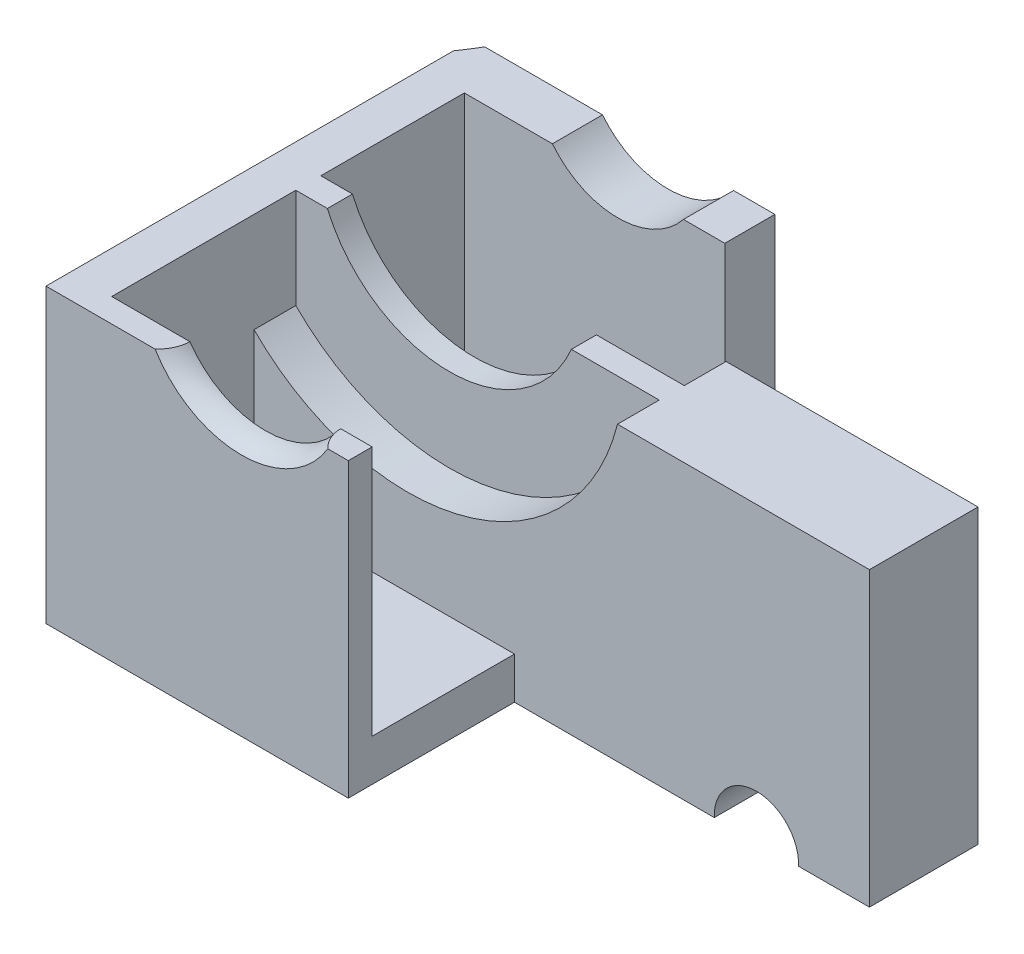
ISO-10303-21;
HEADER;
FILE_DESCRIPTION(('STEP AP214'),'2;1');
FILE_NAME('part.step','',(''),(''),'','','');
FILE_SCHEMA(('AUTOMOTIVE_DESIGN { 1 0 10303 214 1 1 1 1 }'));
ENDSEC;
DATA;
#1=APPLICATION_CONTEXT('core data for automotive mechanical design processes');
#2=APPLICATION_PROTOCOL_DEFINITION('international standard','automotive_design',2000,#1);
#3=PRODUCT_CONTEXT('',#1,'mechanical');
#4=PRODUCT('Part','Part','',(#3));
#5=PRODUCT_RELATED_PRODUCT_CATEGORY('part','',(#4));
#6=PRODUCT_DEFINITION_FORMATION('','',#4);
#7=PRODUCT_DEFINITION_CONTEXT('part definition',#1,'design');
#8=PRODUCT_DEFINITION('design','',#6,#7);
#9=PRODUCT_DEFINITION_SHAPE('','',#8);
#10=(LENGTH_UNIT() NAMED_UNIT(*) SI_UNIT(.MILLI.,.METRE.));
#11=(NAMED_UNIT(*) PLANE_ANGLE_UNIT() SI_UNIT($,.RADIAN.));
#12=(NAMED_UNIT(*) SI_UNIT($,.STERADIAN.) SOLID_ANGLE_UNIT());
#13=UNCERTAINTY_MEASURE_WITH_UNIT(LENGTH_MEASURE(1.E-05),#10,'distance_accuracy_value','');
#14=(GEOMETRIC_REPRESENTATION_CONTEXT(3) GLOBAL_UNCERTAINTY_ASSIGNED_CONTEXT((#13)) GLOBAL_UNIT_ASSIGNED_CONTEXT((#10,
#11,#12)) REPRESENTATION_CONTEXT('',''));
#15=CARTESIAN_POINT('',(0.,0.,0.));
#16=DIRECTION('',(0.,0.,1.));
#17=DIRECTION('',(1.,0.,0.));
#18=AXIS2_PLACEMENT_3D('',#15,#16,#17);
#19=CARTESIAN_POINT('',(0.,50.8,0.));
#20=DIRECTION('',(0.,-1.,0.));
#21=DIRECTION('',(0.,0.,-1.));
#22=AXIS2_PLACEMENT_3D('',#19,#20,#21);
#23=PLANE('',#22);
#24=DIRECTION('',(0.866025403784436,0.,0.500000000000005));
#25=VECTOR('',#24,1.);
#26=CARTESIAN_POINT('',(219.202,50.8,-83.6273104035633));
#27=LINE('',#26,#25);
#28=CARTESIAN_POINT('',(200.279,50.8,-94.5525095474388));
#29=VERTEX_POINT('',#28);
#30=CARTESIAN_POINT('',(219.202,50.8,-83.6273104035633));
#31=VERTEX_POINT('',#30);
#32=EDGE_CURVE('E301',#29,#31,#27,.T.);
#33=ORIENTED_EDGE('',*,*,#32,.F.);
#34=DIRECTION('',(0.,0.,-1.));
#35=VECTOR('',#34,1.);
#36=CARTESIAN_POINT('',(200.279,50.8,-94.5525095474388));
#37=LINE('',#36,#35);
#38=CARTESIAN_POINT('',(200.279,50.8,-50.5424504525612));
#39=VERTEX_POINT('',#38);
#40=EDGE_CURVE('E321',#39,#29,#37,.T.);
#41=ORIENTED_EDGE('',*,*,#40,.F.);
#42=DIRECTION('',(-0.866025403784436,0.,0.500000000000004));
#43=VECTOR('',#42,1.);
#44=CARTESIAN_POINT('',(200.279,50.8,-50.5424504525612));
#45=LINE('',#44,#43);
#46=CARTESIAN_POINT('',(219.202,50.8,-61.4676495964367));
#47=VERTEX_POINT('',#46);
#48=EDGE_CURVE('E115',#47,#39,#45,.T.);
#49=ORIENTED_EDGE('',*,*,#48,.F.);
#50=DIRECTION('',(0.,0.,1.));
#51=VECTOR('',#50,1.);
#52=CARTESIAN_POINT('',(219.202,50.8,-4.60248000000001));
#53=LINE('',#52,#51);
#54=EDGE_CURVE('E122',#31,#47,#53,.T.);
#55=ORIENTED_EDGE('',*,*,#54,.F.);
#56=EDGE_LOOP('',(#33,#41,#49,#55));
#57=FACE_BOUND('',#56,.T.);
#58=ADVANCED_FACE('F58',(#57),#23,.F.);
#59=CARTESIAN_POINT('',(0.,12.7,0.));
#60=DIRECTION('',(0.,-1.,0.));
#61=DIRECTION('',(0.,0.,-1.));
#62=AXIS2_PLACEMENT_3D('',#59,#60,#61);
#63=PLANE('',#62);
#64=DIRECTION('',(0.,0.,1.));
#65=VECTOR('',#64,1.);
#66=CARTESIAN_POINT('',(311.15,12.7,-4.60248000000001));
#67=LINE('',#66,#65);
#68=CARTESIAN_POINT('',(311.15,12.7,-55.13324));
#69=VERTEX_POINT('',#68);
#70=CARTESIAN_POINT('',(311.15,12.7,-11.84656));
#71=VERTEX_POINT('',#70);
#72=EDGE_CURVE('E168',#69,#71,#67,.T.);
#73=ORIENTED_EDGE('',*,*,#72,.F.);
#74=DIRECTION('',(-1.,0.,0.));
#75=VECTOR('',#74,1.);
#76=CARTESIAN_POINT('',(419.1,12.7,-55.13324));
#77=LINE('',#76,#75);
#78=CARTESIAN_POINT('',(231.939280820751,12.7,-55.13324));
#79=VERTEX_POINT('',#78);
#80=EDGE_CURVE('E502',#69,#79,#77,.T.);
#81=ORIENTED_EDGE('',*,*,#80,.T.);
#82=DIRECTION('',(0.,0.,1.));
#83=VECTOR('',#82,1.);
#84=CARTESIAN_POINT('',(231.939280820751,12.7,-55.1332399999999));
#85=LINE('',#84,#83);
#86=CARTESIAN_POINT('',(231.939280820751,12.7,-11.84656));
#87=VERTEX_POINT('',#86);
#88=EDGE_CURVE('E140',#79,#87,#85,.T.);
#89=ORIENTED_EDGE('',*,*,#88,.T.);
#90=DIRECTION('',(1.,0.,0.));
#91=VECTOR('',#90,1.);
#92=CARTESIAN_POINT('',(231.939280820751,12.7,-11.84656));
#93=LINE('',#92,#91);
#94=EDGE_CURVE('E165',#87,#71,#93,.T.);
#95=ORIENTED_EDGE('',*,*,#94,.T.);
#96=EDGE_LOOP('',(#73,#81,#89,#95));
#97=FACE_BOUND('',#96,.T.);
#98=ADVANCED_FACE('F199',(#97),#63,.F.);
#99=CARTESIAN_POINT('',(278.649352084686,104.852009966003,-189.080548980707));
#100=DIRECTION('',(0.,0.,1.));
#101=DIRECTION('',(1.,0.,0.));
#102=AXIS2_PLACEMENT_3D('',#99,#100,#101);
#103=CYLINDRICAL_SURFACE('',#102,65.786);
#104=CARTESIAN_POINT('',(278.649352084686,104.852009966003,-67.83324));
#105=DIRECTION('',(0.,0.,-1.));
#106=DIRECTION('',(-1.,0.,0.));
#107=AXIS2_PLACEMENT_3D('',#104,#105,#106);
#108=CIRCLE('',#107,65.786);
#109=CARTESIAN_POINT('',(231.939280820751,58.5274264436635,-67.83324));
#110=VERTEX_POINT('',#109);
#111=CARTESIAN_POINT('',(342.472006166481,88.9,-67.83324));
#112=VERTEX_POINT('',#111);
#113=EDGE_CURVE('E508',#110,#112,#108,.F.);
#114=ORIENTED_EDGE('',*,*,#113,.F.);
#115=DIRECTION('',(0.,0.,1.));
#116=VECTOR('',#115,1.);
#117=CARTESIAN_POINT('',(231.939280820751,58.5274264436635,-189.080548980707));
#118=LINE('',#117,#116);
#119=CARTESIAN_POINT('',(231.939280820751,58.5274264436635,-55.1332399999999));
#120=VERTEX_POINT('',#119);
#121=EDGE_CURVE('E507',#110,#120,#118,.T.);
#122=ORIENTED_EDGE('',*,*,#121,.T.);
#123=CARTESIAN_POINT('',(278.649352084686,104.852009966003,-55.1332399999999));
#124=DIRECTION('',(0.,0.,1.));
#125=DIRECTION('',(1.,0.,0.));
#126=AXIS2_PLACEMENT_3D('',#123,#124,#125);
#127=CIRCLE('',#126,65.786);
#128=CARTESIAN_POINT('',(342.472006166481,88.9,-55.1332399999999));
#129=VERTEX_POINT('',#128);
#130=EDGE_CURVE('E512',#120,#129,#127,.T.);
#131=ORIENTED_EDGE('',*,*,#130,.T.);
#132=DIRECTION('',(0.,0.,1.));
#133=VECTOR('',#132,1.);
#134=CARTESIAN_POINT('',(342.472006166481,88.9,-189.080548980707));
#135=LINE('',#134,#133);
#136=EDGE_CURVE('E519',#112,#129,#135,.T.);
#137=ORIENTED_EDGE('',*,*,#136,.F.);
#138=EDGE_LOOP('',(#114,#122,#131,#137));
#139=FACE_BOUND('',#138,.T.);
#140=ADVANCED_FACE('F203',(#139),#103,.F.);
#141=CARTESIAN_POINT('',(0.,0.,0.));
#142=DIRECTION('',(0.,-1.,0.));
#143=DIRECTION('',(0.,0.,-1.));
#144=AXIS2_PLACEMENT_3D('',#141,#142,#143);
#145=PLANE('',#144);
#146=DIRECTION('',(0.,0.,-1.));
#147=VECTOR('',#146,1.);
#148=CARTESIAN_POINT('',(397.551903334925,0.,33.9832349236573));
#149=LINE('',#148,#147);
#150=CARTESIAN_POINT('',(397.551903334925,0.,-88.15324));
#151=VERTEX_POINT('',#150);
#152=CARTESIAN_POINT('',(397.551903334925,0.,-55.13324));
#153=VERTEX_POINT('',#152);
#154=EDGE_CURVE('E625',#151,#153,#149,.F.);
#155=ORIENTED_EDGE('',*,*,#154,.F.);
#156=DIRECTION('',(1.,0.,0.));
#157=VECTOR('',#156,1.);
#158=CARTESIAN_POINT('',(231.939280820751,0.,-88.15324));
#159=LINE('',#158,#157);
#160=CARTESIAN_POINT('',(419.1,0.,-88.15324));
#161=VERTEX_POINT('',#160);
#162=EDGE_CURVE('E649',#151,#161,#159,.T.);
#163=ORIENTED_EDGE('',*,*,#162,.T.);
#164=DIRECTION('',(0.,0.,-1.));
#165=VECTOR('',#164,1.);
#166=CARTESIAN_POINT('',(419.1,0.,0.));
#167=LINE('',#166,#165);
#168=CARTESIAN_POINT('',(419.1,0.,-55.13324));
#169=VERTEX_POINT('',#168);
#170=EDGE_CURVE('E314',#169,#161,#167,.T.);
#171=ORIENTED_EDGE('',*,*,#170,.F.);
#172=DIRECTION('',(-1.,0.,0.));
#173=VECTOR('',#172,1.);
#174=CARTESIAN_POINT('',(419.1,0.,-55.13324));
#175=LINE('',#174,#173);
#176=EDGE_CURVE('E657',#169,#153,#175,.T.);
#177=ORIENTED_EDGE('',*,*,#176,.T.);
#178=EDGE_LOOP('',(#155,#163,#171,#177));
#179=FACE_BOUND('',#178,.T.);
#180=ADVANCED_FACE('F268',(#179),#145,.T.);
#181=CARTESIAN_POINT('',(419.1,88.9,0.));
#182=DIRECTION('',(-1.,0.,0.));
#183=DIRECTION('',(0.,0.,1.));
#184=AXIS2_PLACEMENT_3D('',#181,#182,#183);
#185=PLANE('',#184);
#186=DIRECTION('',(0.,1.,0.));
#187=VECTOR('',#186,1.);
#188=CARTESIAN_POINT('',(419.1,0.,-88.15324));
#189=LINE('',#188,#187);
#190=CARTESIAN_POINT('',(419.1,88.9,-88.15324));
#191=VERTEX_POINT('',#190);
#192=EDGE_CURVE('E316',#161,#191,#189,.T.);
#193=ORIENTED_EDGE('',*,*,#192,.T.);
#194=DIRECTION('',(0.,0.,-1.));
#195=VECTOR('',#194,1.);
#196=CARTESIAN_POINT('',(419.1,88.9,0.));
#197=LINE('',#196,#195);
#198=CARTESIAN_POINT('',(419.1,88.9,-55.13324));
#199=VERTEX_POINT('',#198);
#200=EDGE_CURVE('E539',#199,#191,#197,.T.);
#201=ORIENTED_EDGE('',*,*,#200,.F.);
#202=DIRECTION('',(0.,1.,0.));
#203=VECTOR('',#202,1.);
#204=CARTESIAN_POINT('',(419.1,0.,-55.13324));
#205=LINE('',#204,#203);
#206=EDGE_CURVE('E509',#169,#199,#205,.T.);
#207=ORIENTED_EDGE('',*,*,#206,.F.);
#208=ORIENTED_EDGE('',*,*,#170,.T.);
#209=EDGE_LOOP('',(#193,#201,#207,#208));
#210=FACE_BOUND('',#209,.T.);
#211=ADVANCED_FACE('F285',(#210),#185,.F.);
#212=CARTESIAN_POINT('',(0.,88.9,0.));
#213=DIRECTION('',(0.,-1.,0.));
#214=DIRECTION('',(0.,0.,-1.));
#215=AXIS2_PLACEMENT_3D('',#212,#213,#214);
#216=PLANE('',#215);
#217=DIRECTION('',(1.,0.,0.));
#218=VECTOR('',#217,1.);
#219=CARTESIAN_POINT('',(231.939280820751,88.9,-88.15324));
#220=LINE('',#219,#218);
#221=CARTESIAN_POINT('',(342.472006166481,88.9,-88.15324));
#222=VERTEX_POINT('',#221);
#223=EDGE_CURVE('E536',#222,#191,#220,.T.);
#224=ORIENTED_EDGE('',*,*,#223,.F.);
#225=DIRECTION('',(0.,0.,-1.));
#226=VECTOR('',#225,1.);
#227=CARTESIAN_POINT('',(342.472006166481,88.9,45.794068980707));
#228=LINE('',#227,#226);
#229=CARTESIAN_POINT('',(342.472006166481,88.9,-75.45324));
#230=VERTEX_POINT('',#229);
#231=EDGE_CURVE('E589',#230,#222,#228,.T.);
#232=ORIENTED_EDGE('',*,*,#231,.F.);
#233=DIRECTION('',(-1.,0.,0.));
#234=VECTOR('',#233,1.);
#235=CARTESIAN_POINT('',(231.939280820751,88.9,-75.45324));
#236=LINE('',#235,#234);
#237=CARTESIAN_POINT('',(315.751405586406,88.9,-75.45324));
#238=VERTEX_POINT('',#237);
#239=EDGE_CURVE('E595',#230,#238,#236,.T.);
#240=ORIENTED_EDGE('',*,*,#239,.T.);
#241=DIRECTION('',(0.,0.,1.));
#242=VECTOR('',#241,1.);
#243=CARTESIAN_POINT('',(315.751405586406,88.9,-75.45324));
#244=LINE('',#243,#242);
#245=CARTESIAN_POINT('',(315.751405586406,88.9,-67.83324));
#246=VERTEX_POINT('',#245);
#247=EDGE_CURVE('E135',#246,#238,#244,.F.);
#248=ORIENTED_EDGE('',*,*,#247,.F.);
#249=DIRECTION('',(-1.,0.,0.));
#250=VECTOR('',#249,1.);
#251=CARTESIAN_POINT('',(231.939280820751,88.9,-67.83324));
#252=LINE('',#251,#250);
#253=EDGE_CURVE('E523',#112,#246,#252,.T.);
#254=ORIENTED_EDGE('',*,*,#253,.F.);
#255=ORIENTED_EDGE('',*,*,#136,.T.);
#256=DIRECTION('',(-1.,0.,0.));
#257=VECTOR('',#256,1.);
#258=CARTESIAN_POINT('',(419.1,88.9,-55.13324));
#259=LINE('',#258,#257);
#260=EDGE_CURVE('E514',#199,#129,#259,.T.);
#261=ORIENTED_EDGE('',*,*,#260,.F.);
#262=ORIENTED_EDGE('',*,*,#200,.T.);
#263=EDGE_LOOP('',(#224,#232,#240,#248,#254,#255,#261,#262));
#264=FACE_BOUND('',#263,.T.);
#265=ADVANCED_FACE('F264',(#264),#216,.F.);
#266=CARTESIAN_POINT('',(278.649352084686,104.852009966003,45.794068980707));
#267=DIRECTION('',(0.,0.,-1.));
#268=DIRECTION('',(-1.,0.,0.));
#269=AXIS2_PLACEMENT_3D('',#266,#267,#268);
#270=CYLINDRICAL_SURFACE('',#269,65.786);
#271=CARTESIAN_POINT('',(278.649352084686,104.852009966003,-75.45324));
#272=DIRECTION('',(0.,0.,-1.));
#273=DIRECTION('',(-1.,0.,0.));
#274=AXIS2_PLACEMENT_3D('',#271,#272,#273);
#275=CIRCLE('',#274,65.786);
#276=CARTESIAN_POINT('',(231.939280820751,58.5274264436635,-75.45324));
#277=VERTEX_POINT('',#276);
#278=EDGE_CURVE('E517',#277,#230,#275,.F.);
#279=ORIENTED_EDGE('',*,*,#278,.T.);
#280=ORIENTED_EDGE('',*,*,#231,.T.);
#281=CARTESIAN_POINT('',(278.649352084686,104.852009966003,-88.15324));
#282=DIRECTION('',(0.,0.,-1.));
#283=DIRECTION('',(1.,0.,0.));
#284=AXIS2_PLACEMENT_3D('',#281,#282,#283);
#285=CIRCLE('',#284,65.786);
#286=CARTESIAN_POINT('',(231.939280820751,58.5274264436635,-88.15324));
#287=VERTEX_POINT('',#286);
#288=EDGE_CURVE('E552',#222,#287,#285,.T.);
#289=ORIENTED_EDGE('',*,*,#288,.T.);
#290=DIRECTION('',(0.,0.,-1.));
#291=VECTOR('',#290,1.);
#292=CARTESIAN_POINT('',(231.939280820751,58.5274264436635,45.794068980707));
#293=LINE('',#292,#291);
#294=EDGE_CURVE('E594',#277,#287,#293,.T.);
#295=ORIENTED_EDGE('',*,*,#294,.F.);
#296=EDGE_LOOP('',(#279,#280,#289,#295));
#297=FACE_BOUND('',#296,.T.);
#298=ADVANCED_FACE('F261',(#297),#270,.F.);
#299=DIRECTION('',(0.,0.,1.));
#300=VECTOR('',#299,1.);
#301=CARTESIAN_POINT('',(231.939280820751,12.7,-119.09298));
#302=LINE('',#301,#300);
#303=CARTESIAN_POINT('',(231.939280820751,12.7,-119.09298));
#304=VERTEX_POINT('',#303);
#305=CARTESIAN_POINT('',(231.939280820751,12.7,-88.15324));
#306=VERTEX_POINT('',#305);
#307=EDGE_CURVE('E568',#304,#306,#302,.T.);
#308=ORIENTED_EDGE('',*,*,#307,.T.);
#309=DIRECTION('',(1.,0.,0.));
#310=VECTOR('',#309,1.);
#311=CARTESIAN_POINT('',(231.939280820751,12.7,-88.15324));
#312=LINE('',#311,#310);
#313=CARTESIAN_POINT('',(311.15,12.7,-88.15324));
#314=VERTEX_POINT('',#313);
#315=EDGE_CURVE('E573',#306,#314,#312,.T.);
#316=ORIENTED_EDGE('',*,*,#315,.T.);
#317=DIRECTION('',(0.,0.,1.));
#318=VECTOR('',#317,1.);
#319=CARTESIAN_POINT('',(311.15,12.7,-4.60248000000001));
#320=LINE('',#319,#318);
#321=CARTESIAN_POINT('',(311.15,12.7,-119.09298));
#322=VERTEX_POINT('',#321);
#323=EDGE_CURVE('E556',#322,#314,#320,.T.);
#324=ORIENTED_EDGE('',*,*,#323,.F.);
#325=DIRECTION('',(-1.,0.,0.));
#326=VECTOR('',#325,1.);
#327=CARTESIAN_POINT('',(419.1,12.7,-119.09298));
#328=LINE('',#327,#326);
#329=EDGE_CURVE('E564',#322,#304,#328,.T.);
#330=ORIENTED_EDGE('',*,*,#329,.T.);
#331=EDGE_LOOP('',(#308,#316,#324,#330));
#332=FACE_BOUND('',#331,.T.);
#333=ADVANCED_FACE('F205',(#332),#63,.F.);
#334=DIRECTION('',(-1.,0.,0.));
#335=VECTOR('',#334,1.);
#336=CARTESIAN_POINT('',(419.1,88.9,-119.09298));
#337=LINE('',#336,#335);
#338=CARTESIAN_POINT('',(311.15,88.9,-119.09298));
#339=VERTEX_POINT('',#338);
#340=CARTESIAN_POINT('',(298.578253385172,88.9,-119.09298));
#341=VERTEX_POINT('',#340);
#342=EDGE_CURVE('E531',#339,#341,#337,.T.);
#343=ORIENTED_EDGE('',*,*,#342,.F.);
#344=DIRECTION('',(0.,0.,1.));
#345=VECTOR('',#344,1.);
#346=CARTESIAN_POINT('',(311.15,88.9,-134.33298));
#347=LINE('',#346,#345);
#348=CARTESIAN_POINT('',(311.15,88.9,-134.33298));
#349=VERTEX_POINT('',#348);
#350=EDGE_CURVE('E559',#349,#339,#347,.T.);
#351=ORIENTED_EDGE('',*,*,#350,.F.);
#352=DIRECTION('',(1.,0.,0.));
#353=VECTOR('',#352,1.);
#354=CARTESIAN_POINT('',(419.1,88.9,-134.33298));
#355=LINE('',#354,#353);
#356=CARTESIAN_POINT('',(298.578253385172,88.9,-134.33298));
#357=VERTEX_POINT('',#356);
#358=EDGE_CURVE('E562',#357,#349,#355,.T.);
#359=ORIENTED_EDGE('',*,*,#358,.F.);
#360=DIRECTION('',(0.,0.,-1.));
#361=VECTOR('',#360,1.);
#362=CARTESIAN_POINT('',(298.578253385172,88.9,-46.891720786604));
#363=LINE('',#362,#361);
#364=EDGE_CURVE('E583',#357,#341,#363,.F.);
#365=ORIENTED_EDGE('',*,*,#364,.T.);
#366=EDGE_LOOP('',(#343,#351,#359,#365));
#367=FACE_BOUND('',#366,.T.);
#368=ADVANCED_FACE('F227',(#367),#216,.F.);
#369=CARTESIAN_POINT('',(231.939280820751,0.,-11.84656));
#370=DIRECTION('',(0.,0.,1.));
#371=DIRECTION('',(1.,0.,0.));
#372=AXIS2_PLACEMENT_3D('',#369,#370,#371);
#373=PLANE('',#372);
#374=DIRECTION('',(0.,1.,0.));
#375=VECTOR('',#374,1.);
#376=CARTESIAN_POINT('',(231.939280820751,0.,-11.84656));
#377=LINE('',#376,#375);
#378=CARTESIAN_POINT('',(231.939280820751,88.9,-11.84656));
#379=VERTEX_POINT('',#378);
#380=EDGE_CURVE('E150',#87,#379,#377,.T.);
#381=ORIENTED_EDGE('',*,*,#380,.T.);
#382=DIRECTION('',(1.,0.,0.));
#383=VECTOR('',#382,1.);
#384=CARTESIAN_POINT('',(231.939280820751,88.9,-11.84656));
#385=LINE('',#384,#383);
#386=CARTESIAN_POINT('',(255.710804222091,88.9,-11.84656));
#387=VERTEX_POINT('',#386);
#388=EDGE_CURVE('E68',#379,#387,#385,.T.);
#389=ORIENTED_EDGE('',*,*,#388,.T.);
#390=CARTESIAN_POINT('',(278.649352084686,104.852009966003,-11.84656));
#391=DIRECTION('',(0.,0.,-1.));
#392=DIRECTION('',(-1.,0.,0.));
#393=AXIS2_PLACEMENT_3D('',#390,#391,#392);
#394=CIRCLE('',#393,27.94);
#395=CARTESIAN_POINT('',(301.58789994728,88.9,-11.84656));
#396=VERTEX_POINT('',#395);
#397=EDGE_CURVE('E171',#396,#387,#394,.T.);
#398=ORIENTED_EDGE('',*,*,#397,.F.);
#399=CARTESIAN_POINT('',(311.15,88.9,-11.84656));
#400=VERTEX_POINT('',#399);
#401=EDGE_CURVE('E490',#396,#400,#385,.T.);
#402=ORIENTED_EDGE('',*,*,#401,.T.);
#403=DIRECTION('',(0.,-1.,0.));
#404=VECTOR('',#403,1.);
#405=CARTESIAN_POINT('',(311.15,0.,-11.84656));
#406=LINE('',#405,#404);
#407=EDGE_CURVE('E162',#400,#71,#406,.T.);
#408=ORIENTED_EDGE('',*,*,#407,.T.);
#409=ORIENTED_EDGE('',*,*,#94,.F.);
#410=EDGE_LOOP('',(#381,#389,#398,#402,#408,#409));
#411=FACE_BOUND('',#410,.T.);
#412=ADVANCED_FACE('F223',(#411),#373,.F.);
#413=CARTESIAN_POINT('',(278.649352084686,104.852009966003,-46.891720786604));
#414=DIRECTION('',(0.,0.,-1.));
#415=DIRECTION('',(-1.,0.,0.));
#416=AXIS2_PLACEMENT_3D('',#413,#414,#415);
#417=CYLINDRICAL_SURFACE('',#416,25.527);
#418=CARTESIAN_POINT('',(278.649352084686,104.852009966003,-134.33298));
#419=DIRECTION('',(0.,0.,-1.));
#420=DIRECTION('',(-1.,0.,0.));
#421=AXIS2_PLACEMENT_3D('',#418,#419,#420);
#422=CIRCLE('',#421,25.527);
#423=CARTESIAN_POINT('',(258.720450784199,88.9,-134.33298));
#424=VERTEX_POINT('',#423);
#425=EDGE_CURVE('E125',#424,#357,#422,.F.);
#426=ORIENTED_EDGE('',*,*,#425,.F.);
#427=DIRECTION('',(0.,0.,-1.));
#428=VECTOR('',#427,1.);
#429=CARTESIAN_POINT('',(258.720450784199,88.9,-46.891720786604));
#430=LINE('',#429,#428);
#431=CARTESIAN_POINT('',(258.720450784199,88.9,-119.09298));
#432=VERTEX_POINT('',#431);
#433=EDGE_CURVE('E586',#432,#424,#430,.T.);
#434=ORIENTED_EDGE('',*,*,#433,.F.);
#435=CARTESIAN_POINT('',(278.649352084686,104.852009966003,-119.09298));
#436=DIRECTION('',(0.,0.,-1.));
#437=DIRECTION('',(-1.,0.,0.));
#438=AXIS2_PLACEMENT_3D('',#435,#436,#437);
#439=CIRCLE('',#438,25.527);
#440=EDGE_CURVE('E561',#432,#341,#439,.F.);
#441=ORIENTED_EDGE('',*,*,#440,.T.);
#442=ORIENTED_EDGE('',*,*,#364,.F.);
#443=EDGE_LOOP('',(#426,#434,#441,#442));
#444=FACE_BOUND('',#443,.T.);
#445=ADVANCED_FACE('F226',(#444),#417,.F.);
#446=CARTESIAN_POINT('',(419.1,0.,-119.09298));
#447=DIRECTION('',(0.,0.,-1.));
#448=DIRECTION('',(-1.,0.,0.));
#449=AXIS2_PLACEMENT_3D('',#446,#447,#448);
#450=PLANE('',#449);
#451=DIRECTION('',(0.,1.,0.));
#452=VECTOR('',#451,1.);
#453=CARTESIAN_POINT('',(311.15,-12.7,-119.09298));
#454=LINE('',#453,#452);
#455=EDGE_CURVE('E630',#322,#339,#454,.T.);
#456=ORIENTED_EDGE('',*,*,#455,.T.);
#457=ORIENTED_EDGE('',*,*,#342,.T.);
#458=ORIENTED_EDGE('',*,*,#440,.F.);
#459=CARTESIAN_POINT('',(231.939280820751,88.9,-119.09298));
#460=VERTEX_POINT('',#459);
#461=EDGE_CURVE('E534',#432,#460,#337,.T.);
#462=ORIENTED_EDGE('',*,*,#461,.T.);
#463=DIRECTION('',(0.,1.,0.));
#464=VECTOR('',#463,1.);
#465=CARTESIAN_POINT('',(231.939280820751,0.,-119.09298));
#466=LINE('',#465,#464);
#467=EDGE_CURVE('E642',#304,#460,#466,.T.);
#468=ORIENTED_EDGE('',*,*,#467,.F.);
#469=ORIENTED_EDGE('',*,*,#329,.F.);
#470=EDGE_LOOP('',(#456,#457,#458,#462,#468,#469));
#471=FACE_BOUND('',#470,.T.);
#472=ADVANCED_FACE('F246',(#471),#450,.F.);
#473=CARTESIAN_POINT('',(231.939280820751,0.,-119.09298));
#474=DIRECTION('',(-1.,0.,0.));
#475=DIRECTION('',(0.,0.,1.));
#476=AXIS2_PLACEMENT_3D('',#473,#474,#475);
#477=PLANE('',#476);
#478=ORIENTED_EDGE('',*,*,#467,.T.);
#479=DIRECTION('',(0.,0.,1.));
#480=VECTOR('',#479,1.);
#481=CARTESIAN_POINT('',(231.939280820751,88.9,-119.09298));
#482=LINE('',#481,#480);
#483=CARTESIAN_POINT('',(231.939280820751,88.9,-75.45324));
#484=VERTEX_POINT('',#483);
#485=EDGE_CURVE('E533',#460,#484,#482,.T.);
#486=ORIENTED_EDGE('',*,*,#485,.T.);
#487=DIRECTION('',(0.,-1.,0.));
#488=VECTOR('',#487,1.);
#489=CARTESIAN_POINT('',(231.939280820751,88.9,-75.45324));
#490=LINE('',#489,#488);
#491=EDGE_CURVE('E590',#484,#277,#490,.T.);
#492=ORIENTED_EDGE('',*,*,#491,.T.);
#493=ORIENTED_EDGE('',*,*,#294,.T.);
#494=DIRECTION('',(0.,1.,0.));
#495=VECTOR('',#494,1.);
#496=CARTESIAN_POINT('',(231.939280820751,0.,-88.15324));
#497=LINE('',#496,#495);
#498=EDGE_CURVE('E639',#306,#287,#497,.T.);
#499=ORIENTED_EDGE('',*,*,#498,.F.);
#500=ORIENTED_EDGE('',*,*,#307,.F.);
#501=EDGE_LOOP('',(#478,#486,#492,#493,#499,#500));
#502=FACE_BOUND('',#501,.T.);
#503=ADVANCED_FACE('F259',(#502),#477,.F.);
#504=CARTESIAN_POINT('',(278.649352084686,104.852009966003,-75.45324));
#505=DIRECTION('',(0.,0.,-1.));
#506=DIRECTION('',(-1.,0.,0.));
#507=AXIS2_PLACEMENT_3D('',#504,#505,#506);
#508=PLANE('',#507);
#509=ORIENTED_EDGE('',*,*,#278,.F.);
#510=ORIENTED_EDGE('',*,*,#491,.F.);
#511=CARTESIAN_POINT('',(241.547298582965,88.9,-75.45324));
#512=VERTEX_POINT('',#511);
#513=EDGE_CURVE('E593',#512,#484,#236,.T.);
#514=ORIENTED_EDGE('',*,*,#513,.F.);
#515=CARTESIAN_POINT('',(278.649352084686,104.852009966003,-75.45324));
#516=DIRECTION('',(0.,0.,-1.));
#517=DIRECTION('',(-1.,0.,0.));
#518=AXIS2_PLACEMENT_3D('',#515,#516,#517);
#519=CIRCLE('',#518,40.386);
#520=EDGE_CURVE('E527',#238,#512,#519,.T.);
#521=ORIENTED_EDGE('',*,*,#520,.F.);
#522=ORIENTED_EDGE('',*,*,#239,.F.);
#523=EDGE_LOOP('',(#509,#510,#514,#521,#522));
#524=FACE_BOUND('',#523,.T.);
#525=ADVANCED_FACE('F242',(#524),#508,.T.);
#526=CARTESIAN_POINT('',(278.649352084686,104.852009966003,-75.45324));
#527=DIRECTION('',(0.,0.,1.));
#528=DIRECTION('',(1.,0.,0.));
#529=AXIS2_PLACEMENT_3D('',#526,#527,#528);
#530=CYLINDRICAL_SURFACE('',#529,40.386);
#531=ORIENTED_EDGE('',*,*,#247,.T.);
#532=ORIENTED_EDGE('',*,*,#520,.T.);
#533=DIRECTION('',(0.,0.,1.));
#534=VECTOR('',#533,1.);
#535=CARTESIAN_POINT('',(241.547298582965,88.9,-75.45324));
#536=LINE('',#535,#534);
#537=CARTESIAN_POINT('',(241.547298582965,88.9,-67.83324));
#538=VERTEX_POINT('',#537);
#539=EDGE_CURVE('E543',#512,#538,#536,.T.);
#540=ORIENTED_EDGE('',*,*,#539,.T.);
#541=CARTESIAN_POINT('',(278.649352084686,104.852009966003,-67.83324));
#542=DIRECTION('',(0.,0.,-1.));
#543=DIRECTION('',(-1.,0.,0.));
#544=AXIS2_PLACEMENT_3D('',#541,#542,#543);
#545=CIRCLE('',#544,40.386);
#546=EDGE_CURVE('E521',#246,#538,#545,.T.);
#547=ORIENTED_EDGE('',*,*,#546,.F.);
#548=EDGE_LOOP('',(#531,#532,#540,#547));
#549=FACE_BOUND('',#548,.T.);
#550=ADVANCED_FACE('F239',(#549),#530,.F.);
#551=CARTESIAN_POINT('',(278.649352084686,104.852009966003,-67.83324));
#552=DIRECTION('',(0.,0.,-1.));
#553=DIRECTION('',(-1.,0.,0.));
#554=AXIS2_PLACEMENT_3D('',#551,#552,#553);
#555=PLANE('',#554);
#556=ORIENTED_EDGE('',*,*,#113,.T.);
#557=ORIENTED_EDGE('',*,*,#253,.T.);
#558=ORIENTED_EDGE('',*,*,#546,.T.);
#559=CARTESIAN_POINT('',(231.939280820751,88.9,-67.83324));
#560=VERTEX_POINT('',#559);
#561=EDGE_CURVE('E598',#538,#560,#252,.T.);
#562=ORIENTED_EDGE('',*,*,#561,.T.);
#563=DIRECTION('',(0.,-1.,0.));
#564=VECTOR('',#563,1.);
#565=CARTESIAN_POINT('',(231.939280820751,58.5274264436635,-67.83324));
#566=LINE('',#565,#564);
#567=EDGE_CURVE('E480',#560,#110,#566,.T.);
#568=ORIENTED_EDGE('',*,*,#567,.T.);
#569=EDGE_LOOP('',(#556,#557,#558,#562,#568));
#570=FACE_BOUND('',#569,.T.);
#571=ADVANCED_FACE('F221',(#570),#555,.F.);
#572=CARTESIAN_POINT('',(231.939280820751,0.,-55.1332399999999));
#573=DIRECTION('',(-1.,0.,0.));
#574=DIRECTION('',(0.,0.,1.));
#575=AXIS2_PLACEMENT_3D('',#572,#573,#574);
#576=PLANE('',#575);
#577=ORIENTED_EDGE('',*,*,#88,.F.);
#578=DIRECTION('',(0.,1.,0.));
#579=VECTOR('',#578,1.);
#580=CARTESIAN_POINT('',(231.939280820751,0.,-55.1332399999999));
#581=LINE('',#580,#579);
#582=EDGE_CURVE('E504',#79,#120,#581,.T.);
#583=ORIENTED_EDGE('',*,*,#582,.T.);
#584=ORIENTED_EDGE('',*,*,#121,.F.);
#585=ORIENTED_EDGE('',*,*,#567,.F.);
#586=DIRECTION('',(0.,0.,1.));
#587=VECTOR('',#586,1.);
#588=CARTESIAN_POINT('',(231.939280820751,88.9,-55.1332399999999));
#589=LINE('',#588,#587);
#590=EDGE_CURVE('E12',#560,#379,#589,.T.);
#591=ORIENTED_EDGE('',*,*,#590,.T.);
#592=ORIENTED_EDGE('',*,*,#380,.F.);
#593=EDGE_LOOP('',(#577,#583,#584,#585,#591,#592));
#594=FACE_BOUND('',#593,.T.);
#595=ADVANCED_FACE('F197',(#594),#576,.F.);
#596=CARTESIAN_POINT('',(278.649352084686,104.852009966003,-11.84656));
#597=DIRECTION('',(0.,0.,-1.));
#598=DIRECTION('',(-1.,0.,0.));
#599=AXIS2_PLACEMENT_3D('',#596,#597,#598);
#600=TOROIDAL_SURFACE('',#599,38.7279618909091,10.7879618909091);
#601=CARTESIAN_POINT('',(305.321004878148,88.9,-4.24007600000003));
#602=CARTESIAN_POINT('',(305.205450260371,88.9,-4.33981529388964));
#603=CARTESIAN_POINT('',(305.091748468459,88.9,-4.44168215883788));
#604=CARTESIAN_POINT('',(304.868288037795,88.9,-4.64958762691373));
#605=CARTESIAN_POINT('',(304.758528256098,88.9,-4.75562500185442));
#606=CARTESIAN_POINT('',(304.435257263361,88.9,-5.08011873169218));
#607=CARTESIAN_POINT('',(304.227927634503,88.9,-5.30480754574426));
#608=CARTESIAN_POINT('',(303.830143478204,88.9,-5.77192258381844));
#609=CARTESIAN_POINT('',(303.639845265362,88.9,-6.01448190316217));
#610=CARTESIAN_POINT('',(303.280263826349,88.9,-6.51470043072224));
#611=CARTESIAN_POINT('',(303.110977461481,88.9,-6.77235737520827));
#612=CARTESIAN_POINT('',(302.794732658155,88.9,-7.30317781526729));
#613=CARTESIAN_POINT('',(302.647914880176,88.9,-7.57642537936952));
#614=CARTESIAN_POINT('',(302.380300255764,88.9,-8.13521702644439));
#615=CARTESIAN_POINT('',(302.259487466386,88.9,-8.42075344585854));
#616=CARTESIAN_POINT('',(302.046570466324,88.9,-9.00081578750842));
#617=CARTESIAN_POINT('',(301.954330668665,88.9,-9.29529173880165));
#618=CARTESIAN_POINT('',(301.799795254757,88.9,-9.8918372789057));
#619=CARTESIAN_POINT('',(301.737481464282,88.9,-10.1939021413251));
#620=CARTESIAN_POINT('',(301.647568849936,88.9,-10.7808311350058));
#621=CARTESIAN_POINT('',(301.617783425598,88.9,-11.0653573811168));
#622=CARTESIAN_POINT('',(301.593781837837,88.9,-11.4934831214448));
#623=CARTESIAN_POINT('',(301.589233548446,88.9,-11.6365659363068));
#624=CARTESIAN_POINT('',(301.587071375432,88.9,-11.9227941269201));
#625=CARTESIAN_POINT('',(301.589457986998,88.9,-12.065939506409));
#626=CARTESIAN_POINT('',(301.59531606724,88.9,-12.2089639999999));
#627=B_SPLINE_CURVE_WITH_KNOTS('',3,(#601,#602,#603,#604,#605,#606,#607,#608,#609,#610,#611,
#612,#613,#614,#615,#616,#617,#618,#619,#620,#621,#622,#623,#624,#625,#626),.UNSPECIFIED.,.F.,
.F.,(4,2,2,2,2,2,2,2,2,2,2,2,4),(0.,0.457884855672027,0.915635862465829,1.83182186348074,
2.75570088220655,3.67944172769839,4.60874771456681,5.53748233639289,6.46173983704531,
7.38543531908456,8.24225989257602,8.67157807925766,9.10092692237951),.UNSPECIFIED.);
#628=CARTESIAN_POINT('',(304.919337506161,88.9,-4.60248000000002));
#629=VERTEX_POINT('',#628);
#630=EDGE_CURVE('E184',#629,#396,#627,.T.);
#631=ORIENTED_EDGE('',*,*,#630,.T.);
#632=ORIENTED_EDGE('',*,*,#397,.T.);
#633=CARTESIAN_POINT('',(255.703388102131,88.9,-12.2089639999999));
#634=CARTESIAN_POINT('',(255.708835974386,88.9,-12.0759343049629));
#635=CARTESIAN_POINT('',(255.711281891271,88.9,-11.9427999271993));
#636=CARTESIAN_POINT('',(255.710172989999,88.9,-11.6765615694531));
#637=CARTESIAN_POINT('',(255.70661841616,88.9,-11.5434575884534));
#638=CARTESIAN_POINT('',(255.68696848112,88.9,-11.1447265573617));
#639=CARTESIAN_POINT('',(255.661894755533,88.9,-10.8794876939699));
#640=CARTESIAN_POINT('',(255.588541401723,88.9,-10.3543452490769));
#641=CARTESIAN_POINT('',(255.540439377063,88.9,-10.0944164512332));
#642=CARTESIAN_POINT('',(255.421953189825,88.9,-9.57967700395722));
#643=CARTESIAN_POINT('',(255.351567617855,88.9,-9.32486667934293));
#644=CARTESIAN_POINT('',(255.189801848188,88.9,-8.82250330836389));
#645=CARTESIAN_POINT('',(255.098457638305,88.9,-8.57493863288073));
#646=CARTESIAN_POINT('',(254.896041131802,88.9,-8.08800534046245));
#647=CARTESIAN_POINT('',(254.784966698763,88.9,-7.84863761445722));
#648=CARTESIAN_POINT('',(254.54419450244,88.9,-7.37863172260282));
#649=CARTESIAN_POINT('',(254.4144460086,88.9,-7.14801957215524));
#650=CARTESIAN_POINT('',(254.138084246842,88.9,-6.69723564298605));
#651=CARTESIAN_POINT('',(253.991472209624,88.9,-6.47706310403624));
#652=CARTESIAN_POINT('',(253.568471086577,88.9,-5.88895536455704));
#653=CARTESIAN_POINT('',(253.27629919734,88.9,-5.53217581644636));
#654=CARTESIAN_POINT('',(252.809251636686,88.9,-5.02565977995511));
#655=CARTESIAN_POINT('',(252.649156402795,88.9,-4.86192730928595));
#656=CARTESIAN_POINT('',(252.319997263714,88.9,-4.5439087166716));
#657=CARTESIAN_POINT('',(252.150937990043,88.9,-4.38961780356436));
#658=CARTESIAN_POINT('',(251.977699291223,88.9,-4.24007600000004));
#659=B_SPLINE_CURVE_WITH_KNOTS('',3,(#633,#634,#635,#636,#637,#638,#639,#640,#641,#642,#643,
#644,#645,#646,#647,#648,#649,#650,#651,#652,#653,#654,#655,#656,#657,#658),.UNSPECIFIED.,.F.,
.F.,(4,2,2,2,2,2,2,2,2,2,2,2,4),(0.,0.399353408612424,0.798690557298457,1.59678832638183,
2.38882764305282,3.18091706469905,3.97165644515646,4.76248150036607,5.55549697388348,
6.34845460985139,7.72790484515332,8.41459960806278,9.10094296434948),.UNSPECIFIED.);
#660=CARTESIAN_POINT('',(252.37936666321,88.9,-4.60248000000001));
#661=VERTEX_POINT('',#660);
#662=EDGE_CURVE('E177',#387,#661,#659,.T.);
#663=ORIENTED_EDGE('',*,*,#662,.T.);
#664=CARTESIAN_POINT('',(278.649352084686,104.852009966003,-4.60248000000002));
#665=DIRECTION('',(0.,0.,-1.));
#666=DIRECTION('',(-1.,0.,0.));
#667=AXIS2_PLACEMENT_3D('',#664,#665,#666);
#668=CIRCLE('',#667,30.734);
#669=EDGE_CURVE('E174',#629,#661,#668,.T.);
#670=ORIENTED_EDGE('',*,*,#669,.F.);
#671=EDGE_LOOP('',(#631,#632,#663,#670));
#672=FACE_BOUND('',#671,.T.);
#673=ADVANCED_FACE('F192',(#672),#600,.T.);
#674=DIRECTION('',(-1.,0.,0.));
#675=VECTOR('',#674,1.);
#676=CARTESIAN_POINT('',(219.202,88.9,-4.60248000000001));
#677=LINE('',#676,#675);
#678=CARTESIAN_POINT('',(311.15,88.9,-4.60248000000001));
#679=VERTEX_POINT('',#678);
#680=EDGE_CURVE('E684',#679,#629,#677,.T.);
#681=ORIENTED_EDGE('',*,*,#680,.F.);
#682=DIRECTION('',(0.,0.,1.));
#683=VECTOR('',#682,1.);
#684=CARTESIAN_POINT('',(311.15,88.9,-55.13324));
#685=LINE('',#684,#683);
#686=EDGE_CURVE('E169',#400,#679,#685,.T.);
#687=ORIENTED_EDGE('',*,*,#686,.F.);
#688=ORIENTED_EDGE('',*,*,#401,.F.);
#689=ORIENTED_EDGE('',*,*,#630,.F.);
#690=EDGE_LOOP('',(#681,#687,#688,#689));
#691=FACE_BOUND('',#690,.T.);
#692=ADVANCED_FACE('F196',(#691),#216,.F.);
#693=CARTESIAN_POINT('',(0.,0.,-4.60248000000001));
#694=DIRECTION('',(0.,0.,-1.));
#695=DIRECTION('',(-1.,0.,0.));
#696=AXIS2_PLACEMENT_3D('',#693,#694,#695);
#697=PLANE('',#696);
#698=DIRECTION('',(0.,1.,0.));
#699=VECTOR('',#698,1.);
#700=CARTESIAN_POINT('',(311.15,0.,-4.60248000000001));
#701=LINE('',#700,#699);
#702=CARTESIAN_POINT('',(311.15,0.,-4.60248000000001));
#703=VERTEX_POINT('',#702);
#704=EDGE_CURVE('E77',#703,#679,#701,.T.);
#705=ORIENTED_EDGE('',*,*,#704,.T.);
#706=ORIENTED_EDGE('',*,*,#680,.T.);
#707=ORIENTED_EDGE('',*,*,#669,.T.);
#708=CARTESIAN_POINT('',(219.202,88.9,-4.60248000000001));
#709=VERTEX_POINT('',#708);
#710=EDGE_CURVE('E683',#661,#709,#677,.T.);
#711=ORIENTED_EDGE('',*,*,#710,.T.);
#712=DIRECTION('',(0.,-1.,0.));
#713=VECTOR('',#712,1.);
#714=CARTESIAN_POINT('',(219.202,0.,-4.60248000000001));
#715=LINE('',#714,#713);
#716=CARTESIAN_POINT('',(219.202,0.,-4.60248000000001));
#717=VERTEX_POINT('',#716);
#718=EDGE_CURVE('E156',#709,#717,#715,.T.);
#719=ORIENTED_EDGE('',*,*,#718,.T.);
#720=DIRECTION('',(1.,0.,0.));
#721=VECTOR('',#720,1.);
#722=CARTESIAN_POINT('',(219.202,0.,-4.60248000000001));
#723=LINE('',#722,#721);
#724=EDGE_CURVE('E154',#717,#703,#723,.T.);
#725=ORIENTED_EDGE('',*,*,#724,.T.);
#726=EDGE_LOOP('',(#705,#706,#707,#711,#719,#725));
#727=FACE_BOUND('',#726,.T.);
#728=ADVANCED_FACE('F211',(#727),#697,.F.);
#729=CARTESIAN_POINT('',(311.15,-12.7,-55.13324));
#730=DIRECTION('',(-1.,0.,0.));
#731=DIRECTION('',(0.,0.,1.));
#732=AXIS2_PLACEMENT_3D('',#729,#730,#731);
#733=PLANE('',#732);
#734=DIRECTION('',(0.,0.,-1.));
#735=VECTOR('',#734,1.);
#736=CARTESIAN_POINT('',(311.15,0.,0.));
#737=LINE('',#736,#735);
#738=CARTESIAN_POINT('',(311.15,0.,-55.13324));
#739=VERTEX_POINT('',#738);
#740=EDGE_CURVE('E159',#703,#739,#737,.T.);
#741=ORIENTED_EDGE('',*,*,#740,.T.);
#742=DIRECTION('',(0.,-1.,0.));
#743=VECTOR('',#742,1.);
#744=CARTESIAN_POINT('',(311.15,0.,-55.13324));
#745=LINE('',#744,#743);
#746=EDGE_CURVE('E498',#69,#739,#745,.T.);
#747=ORIENTED_EDGE('',*,*,#746,.F.);
#748=ORIENTED_EDGE('',*,*,#72,.T.);
#749=ORIENTED_EDGE('',*,*,#407,.F.);
#750=ORIENTED_EDGE('',*,*,#686,.T.);
#751=ORIENTED_EDGE('',*,*,#704,.F.);
#752=EDGE_LOOP('',(#741,#747,#748,#749,#750,#751));
#753=FACE_BOUND('',#752,.T.);
#754=ADVANCED_FACE('F207',(#753),#733,.F.);
#755=CARTESIAN_POINT('',(419.1,0.,-55.13324));
#756=DIRECTION('',(0.,0.,-1.));
#757=DIRECTION('',(-1.,0.,0.));
#758=AXIS2_PLACEMENT_3D('',#755,#756,#757);
#759=PLANE('',#758);
#760=ORIENTED_EDGE('',*,*,#130,.F.);
#761=ORIENTED_EDGE('',*,*,#582,.F.);
#762=ORIENTED_EDGE('',*,*,#80,.F.);
#763=ORIENTED_EDGE('',*,*,#746,.T.);
#764=CARTESIAN_POINT('',(371.919967655531,0.,-55.13324));
#765=VERTEX_POINT('',#764);
#766=EDGE_CURVE('E659',#765,#739,#175,.T.);
#767=ORIENTED_EDGE('',*,*,#766,.F.);
#768=CARTESIAN_POINT('',(384.735935495228,0.531880937664542,-55.13324));
#769=DIRECTION('',(0.,0.,-1.));
#770=DIRECTION('',(-1.,0.,0.));
#771=AXIS2_PLACEMENT_3D('',#768,#769,#770);
#772=CIRCLE('',#771,12.827);
#773=EDGE_CURVE('E551',#765,#153,#772,.T.);
#774=ORIENTED_EDGE('',*,*,#773,.T.);
#775=ORIENTED_EDGE('',*,*,#176,.F.);
#776=ORIENTED_EDGE('',*,*,#206,.T.);
#777=ORIENTED_EDGE('',*,*,#260,.T.);
#778=EDGE_LOOP('',(#760,#761,#762,#763,#767,#774,#775,#776,#777));
#779=FACE_BOUND('',#778,.T.);
#780=ADVANCED_FACE('F210',(#779),#759,.F.);
#781=CARTESIAN_POINT('',(384.735935495228,0.531880937664542,33.9832349236573));
#782=DIRECTION('',(0.,0.,-1.));
#783=DIRECTION('',(-1.,0.,0.));
#784=AXIS2_PLACEMENT_3D('',#781,#782,#783);
#785=CYLINDRICAL_SURFACE('',#784,12.827);
#786=DIRECTION('',(0.,0.,-1.));
#787=VECTOR('',#786,1.);
#788=CARTESIAN_POINT('',(371.919967655531,0.,33.9832349236573));
#789=LINE('',#788,#787);
#790=CARTESIAN_POINT('',(371.919967655531,0.,-88.15324));
#791=VERTEX_POINT('',#790);
#792=EDGE_CURVE('E620',#765,#791,#789,.T.);
#793=ORIENTED_EDGE('',*,*,#792,.T.);
#794=CARTESIAN_POINT('',(384.735935495228,0.531880937664542,-88.15324));
#795=DIRECTION('',(0.,0.,1.));
#796=DIRECTION('',(1.,0.,0.));
#797=AXIS2_PLACEMENT_3D('',#794,#795,#796);
#798=CIRCLE('',#797,12.827);
#799=EDGE_CURVE('E621',#151,#791,#798,.T.);
#800=ORIENTED_EDGE('',*,*,#799,.F.);
#801=ORIENTED_EDGE('',*,*,#154,.T.);
#802=ORIENTED_EDGE('',*,*,#773,.F.);
#803=EDGE_LOOP('',(#793,#800,#801,#802));
#804=FACE_BOUND('',#803,.T.);
#805=ADVANCED_FACE('F253',(#804),#785,.F.);
#806=CARTESIAN_POINT('',(231.939280820751,0.,-88.15324));
#807=DIRECTION('',(0.,0.,1.));
#808=DIRECTION('',(1.,0.,0.));
#809=AXIS2_PLACEMENT_3D('',#806,#807,#808);
#810=PLANE('',#809);
#811=ORIENTED_EDGE('',*,*,#288,.F.);
#812=ORIENTED_EDGE('',*,*,#223,.T.);
#813=ORIENTED_EDGE('',*,*,#192,.F.);
#814=ORIENTED_EDGE('',*,*,#162,.F.);
#815=ORIENTED_EDGE('',*,*,#799,.T.);
#816=CARTESIAN_POINT('',(311.15,0.,-88.15324));
#817=VERTEX_POINT('',#816);
#818=EDGE_CURVE('E644',#817,#791,#159,.T.);
#819=ORIENTED_EDGE('',*,*,#818,.F.);
#820=DIRECTION('',(0.,1.,0.));
#821=VECTOR('',#820,1.);
#822=CARTESIAN_POINT('',(311.15,0.,-88.15324));
#823=LINE('',#822,#821);
#824=EDGE_CURVE('E635',#817,#314,#823,.T.);
#825=ORIENTED_EDGE('',*,*,#824,.T.);
#826=ORIENTED_EDGE('',*,*,#315,.F.);
#827=ORIENTED_EDGE('',*,*,#498,.T.);
#828=EDGE_LOOP('',(#811,#812,#813,#814,#815,#819,#825,#826,#827));
#829=FACE_BOUND('',#828,.T.);
#830=ADVANCED_FACE('F251',(#829),#810,.F.);
#831=CARTESIAN_POINT('',(311.15,-12.7,-134.33298));
#832=DIRECTION('',(-1.,0.,0.));
#833=DIRECTION('',(0.,0.,1.));
#834=AXIS2_PLACEMENT_3D('',#831,#832,#833);
#835=PLANE('',#834);
#836=DIRECTION('',(0.,1.,0.));
#837=VECTOR('',#836,1.);
#838=CARTESIAN_POINT('',(311.15,-12.7,-134.33298));
#839=LINE('',#838,#837);
#840=CARTESIAN_POINT('',(311.15,0.,-134.33298));
#841=VERTEX_POINT('',#840);
#842=EDGE_CURVE('E631',#841,#349,#839,.T.);
#843=ORIENTED_EDGE('',*,*,#842,.T.);
#844=ORIENTED_EDGE('',*,*,#350,.T.);
#845=ORIENTED_EDGE('',*,*,#455,.F.);
#846=ORIENTED_EDGE('',*,*,#323,.T.);
#847=ORIENTED_EDGE('',*,*,#824,.F.);
#848=DIRECTION('',(0.,0.,-1.));
#849=VECTOR('',#848,1.);
#850=CARTESIAN_POINT('',(311.15,0.,0.));
#851=LINE('',#850,#849);
#852=EDGE_CURVE('E624',#817,#841,#851,.T.);
#853=ORIENTED_EDGE('',*,*,#852,.T.);
#854=EDGE_LOOP('',(#843,#844,#845,#846,#847,#853));
#855=FACE_BOUND('',#854,.T.);
#856=ADVANCED_FACE('F248',(#855),#835,.F.);
#857=DIRECTION('',(0.,0.,1.));
#858=VECTOR('',#857,1.);
#859=CARTESIAN_POINT('',(219.202,0.,-37.62248));
#860=LINE('',#859,#858);
#861=CARTESIAN_POINT('',(219.202,0.,-61.3210026280625));
#862=VERTEX_POINT('',#861);
#863=EDGE_CURVE('E121',#862,#717,#860,.T.);
#864=ORIENTED_EDGE('',*,*,#863,.F.);
#865=DIRECTION('',(0.866025403784436,0.,-0.500000000000004));
#866=VECTOR('',#865,1.);
#867=CARTESIAN_POINT('',(28.2477269692835,0.,48.9264983091321));
#868=LINE('',#867,#866);
#869=CARTESIAN_POINT('',(200.152,0.,-50.32248));
#870=VERTEX_POINT('',#869);
#871=EDGE_CURVE('E62',#870,#862,#868,.T.);
#872=ORIENTED_EDGE('',*,*,#871,.F.);
#873=DIRECTION('',(0.,0.,1.));
#874=VECTOR('',#873,1.);
#875=CARTESIAN_POINT('',(200.152,0.,0.));
#876=LINE('',#875,#874);
#877=CARTESIAN_POINT('',(200.152,0.,-94.77248));
#878=VERTEX_POINT('',#877);
#879=EDGE_CURVE('E95',#878,#870,#876,.T.);
#880=ORIENTED_EDGE('',*,*,#879,.F.);
#881=DIRECTION('',(-0.866025403784436,0.,-0.500000000000005));
#882=VECTOR('',#881,1.);
#883=CARTESIAN_POINT('',(91.0756876298275,0.,-157.747718309132));
#884=LINE('',#883,#882);
#885=CARTESIAN_POINT('',(219.202,2.23240640421734E-10,-83.7739573719372));
#886=VERTEX_POINT('',#885);
#887=EDGE_CURVE('E107',#886,#878,#884,.T.);
#888=ORIENTED_EDGE('',*,*,#887,.F.);
#889=DIRECTION('',(0.,0.,-1.));
#890=VECTOR('',#889,1.);
#891=CARTESIAN_POINT('',(219.202,0.,0.));
#892=LINE('',#891,#890);
#893=CARTESIAN_POINT('',(219.202,0.,-128.546480448172));
#894=VERTEX_POINT('',#893);
#895=EDGE_CURVE('E307',#886,#894,#892,.T.);
#896=ORIENTED_EDGE('',*,*,#895,.T.);
#897=CARTESIAN_POINT('',(156.909021606867,0.,-172.43298));
#898=DIRECTION('',(0.,-1.,0.));
#899=DIRECTION('',(0.,0.,-1.));
#900=AXIS2_PLACEMENT_3D('',#897,#898,#899);
#901=CIRCLE('',#900,76.2);
#902=CARTESIAN_POINT('',(222.900157375241,0.,-134.33298));
#903=VERTEX_POINT('',#902);
#904=EDGE_CURVE('E553',#903,#894,#901,.T.);
#905=ORIENTED_EDGE('',*,*,#904,.F.);
#906=DIRECTION('',(-1.,0.,0.));
#907=VECTOR('',#906,1.);
#908=CARTESIAN_POINT('',(419.1,0.,-134.33298));
#909=LINE('',#908,#907);
#910=EDGE_CURVE('E548',#841,#903,#909,.T.);
#911=ORIENTED_EDGE('',*,*,#910,.F.);
#912=ORIENTED_EDGE('',*,*,#852,.F.);
#913=ORIENTED_EDGE('',*,*,#818,.T.);
#914=ORIENTED_EDGE('',*,*,#792,.F.);
#915=ORIENTED_EDGE('',*,*,#766,.T.);
#916=ORIENTED_EDGE('',*,*,#740,.F.);
#917=ORIENTED_EDGE('',*,*,#724,.F.);
#918=EDGE_LOOP('',(#864,#872,#880,#888,#896,#905,#911,#912,#913,#914,#915,#916,#917));
#919=FACE_BOUND('',#918,.T.);
#920=ADVANCED_FACE('F60',(#919),#145,.T.);
#921=CARTESIAN_POINT('',(0.,0.,-134.33298));
#922=DIRECTION('',(0.,0.,-1.));
#923=DIRECTION('',(-1.,0.,0.));
#924=AXIS2_PLACEMENT_3D('',#921,#922,#923);
#925=PLANE('',#924);
#926=DIRECTION('',(0.,1.,0.));
#927=VECTOR('',#926,1.);
#928=CARTESIAN_POINT('',(222.900157375241,-12.7,-134.33298));
#929=LINE('',#928,#927);
#930=CARTESIAN_POINT('',(222.900157375241,88.9,-134.33298));
#931=VERTEX_POINT('',#930);
#932=EDGE_CURVE('E555',#903,#931,#929,.T.);
#933=ORIENTED_EDGE('',*,*,#932,.T.);
#934=EDGE_CURVE('E560',#931,#424,#355,.T.);
#935=ORIENTED_EDGE('',*,*,#934,.T.);
#936=ORIENTED_EDGE('',*,*,#425,.T.);
#937=ORIENTED_EDGE('',*,*,#358,.T.);
#938=ORIENTED_EDGE('',*,*,#842,.F.);
#939=ORIENTED_EDGE('',*,*,#910,.T.);
#940=EDGE_LOOP('',(#933,#935,#936,#937,#938,#939));
#941=FACE_BOUND('',#940,.T.);
#942=ADVANCED_FACE('F235',(#941),#925,.T.);
#943=ORIENTED_EDGE('',*,*,#590,.F.);
#944=ORIENTED_EDGE('',*,*,#561,.F.);
#945=ORIENTED_EDGE('',*,*,#539,.F.);
#946=ORIENTED_EDGE('',*,*,#513,.T.);
#947=ORIENTED_EDGE('',*,*,#485,.F.);
#948=ORIENTED_EDGE('',*,*,#461,.F.);
#949=ORIENTED_EDGE('',*,*,#433,.T.);
#950=ORIENTED_EDGE('',*,*,#934,.F.);
#951=CARTESIAN_POINT('',(156.909021606867,88.9,-172.43298));
#952=DIRECTION('',(0.,1.,0.));
#953=DIRECTION('',(0.,0.,-1.));
#954=AXIS2_PLACEMENT_3D('',#951,#952,#953);
#955=CIRCLE('',#954,76.2);
#956=CARTESIAN_POINT('',(219.202,88.9,-128.546480448172));
#957=VERTEX_POINT('',#956);
#958=EDGE_CURVE('E557',#957,#931,#955,.T.);
#959=ORIENTED_EDGE('',*,*,#958,.F.);
#960=DIRECTION('',(0.,0.,1.));
#961=VECTOR('',#960,1.);
#962=CARTESIAN_POINT('',(219.202,88.9,-37.62248));
#963=LINE('',#962,#961);
#964=EDGE_CURVE('E493',#957,#709,#963,.T.);
#965=ORIENTED_EDGE('',*,*,#964,.T.);
#966=ORIENTED_EDGE('',*,*,#710,.F.);
#967=ORIENTED_EDGE('',*,*,#662,.F.);
#968=ORIENTED_EDGE('',*,*,#388,.F.);
#969=EDGE_LOOP('',(#943,#944,#945,#946,#947,#948,#949,#950,#959,#965,#966,#967,#968));
#970=FACE_BOUND('',#969,.T.);
#971=ADVANCED_FACE('F190',(#970),#216,.F.);
#972=CARTESIAN_POINT('',(156.909021606867,-12.7,-172.43298));
#973=DIRECTION('',(0.,1.,0.));
#974=DIRECTION('',(0.,0.,1.));
#975=AXIS2_PLACEMENT_3D('',#972,#973,#974);
#976=CYLINDRICAL_SURFACE('',#975,76.2);
#977=DIRECTION('',(0.,1.,0.));
#978=VECTOR('',#977,1.);
#979=CARTESIAN_POINT('',(219.202,-12.7,-128.546480448172));
#980=LINE('',#979,#978);
#981=EDGE_CURVE('E312',#957,#894,#980,.F.);
#982=ORIENTED_EDGE('',*,*,#981,.F.);
#983=ORIENTED_EDGE('',*,*,#958,.T.);
#984=ORIENTED_EDGE('',*,*,#932,.F.);
#985=ORIENTED_EDGE('',*,*,#904,.T.);
#986=EDGE_LOOP('',(#982,#983,#984,#985));
#987=FACE_BOUND('',#986,.T.);
#988=ADVANCED_FACE('F218',(#987),#976,.F.);
#989=CARTESIAN_POINT('',(219.202,88.9,-37.62248));
#990=DIRECTION('',(1.,0.,0.));
#991=DIRECTION('',(0.,0.,-1.));
#992=AXIS2_PLACEMENT_3D('',#989,#990,#991);
#993=PLANE('',#992);
#994=ORIENTED_EDGE('',*,*,#981,.T.);
#995=ORIENTED_EDGE('',*,*,#895,.F.);
#996=DIRECTION('',(0.,0.999995833359375,0.0028867393178934));
#997=VECTOR('',#996,1.);
#998=CARTESIAN_POINT('',(219.202,0.,-83.7739573719375));
#999=LINE('',#998,#997);
#1000=EDGE_CURVE('E298',#886,#31,#999,.T.);
#1001=ORIENTED_EDGE('',*,*,#1000,.T.);
#1002=ORIENTED_EDGE('',*,*,#54,.T.);
#1003=DIRECTION('',(0.,0.999995833359375,-0.00288673931789258));
#1004=VECTOR('',#1003,1.);
#1005=CARTESIAN_POINT('',(219.202,0.,-61.3210026280625));
#1006=LINE('',#1005,#1004);
#1007=EDGE_CURVE('E117',#862,#47,#1006,.T.);
#1008=ORIENTED_EDGE('',*,*,#1007,.F.);
#1009=ORIENTED_EDGE('',*,*,#863,.T.);
#1010=ORIENTED_EDGE('',*,*,#718,.F.);
#1011=ORIENTED_EDGE('',*,*,#964,.F.);
#1012=EDGE_LOOP('',(#994,#995,#1001,#1002,#1008,#1009,#1010,#1011));
#1013=FACE_BOUND('',#1012,.T.);
#1014=ADVANCED_FACE('F206',(#1013),#993,.F.);
#1015=CARTESIAN_POINT('',(91.0751184103374,0.455375592051792,-157.746732392054));
#1016=DIRECTION('',(0.499998437507329,0.00249999218753722,-0.866022697467735));
#1017=DIRECTION('',(-0.866025403784436,0.,-0.500000000000005));
#1018=AXIS2_PLACEMENT_3D('',#1015,#1016,#1017);
#1019=PLANE('',#1018);
#1020=ORIENTED_EDGE('',*,*,#1000,.F.);
#1021=ORIENTED_EDGE('',*,*,#887,.T.);
#1022=DIRECTION('',(0.00249996875058569,0.99998750023437,0.00433007289334913));
#1023=VECTOR('',#1022,1.);
#1024=CARTESIAN_POINT('',(200.152,0.,-94.77248));
#1025=LINE('',#1024,#1023);
#1026=EDGE_CURVE('E103',#878,#29,#1025,.T.);
#1027=ORIENTED_EDGE('',*,*,#1026,.T.);
#1028=ORIENTED_EDGE('',*,*,#32,.T.);
#1029=EDGE_LOOP('',(#1020,#1021,#1027,#1028));
#1030=FACE_BOUND('',#1029,.T.);
#1031=ADVANCED_FACE('F217',(#1030),#1019,.T.);
#1032=CARTESIAN_POINT('',(200.150749057818,-0.5003768726445,0.));
#1033=DIRECTION('',(-0.999996875014648,0.00249999218753639,0.));
#1034=DIRECTION('',(-0.00249999218753639,-0.999996875014649,0.));
#1035=AXIS2_PLACEMENT_3D('',#1032,#1033,#1034);
#1036=PLANE('',#1035);
#1037=ORIENTED_EDGE('',*,*,#1026,.F.);
#1038=ORIENTED_EDGE('',*,*,#879,.T.);
#1039=DIRECTION('',(0.00249996875058569,0.99998750023437,-0.00433007289334886));
#1040=VECTOR('',#1039,1.);
#1041=CARTESIAN_POINT('',(200.152,0.,-50.32248));
#1042=LINE('',#1041,#1040);
#1043=EDGE_CURVE('E100',#870,#39,#1042,.T.);
#1044=ORIENTED_EDGE('',*,*,#1043,.T.);
#1045=ORIENTED_EDGE('',*,*,#40,.T.);
#1046=EDGE_LOOP('',(#1037,#1038,#1044,#1045));
#1047=FACE_BOUND('',#1046,.T.);
#1048=ADVANCED_FACE('F97',(#1047),#1036,.T.);
#1049=CARTESIAN_POINT('',(28.2475504220934,0.141237752110449,48.9261925204289));
#1050=DIRECTION('',(0.499998437507328,0.00249999218753632,0.866022697467735));
#1051=DIRECTION('',(0.866025403784436,0.,-0.500000000000004));
#1052=AXIS2_PLACEMENT_3D('',#1049,#1050,#1051);
#1053=PLANE('',#1052);
#1054=ORIENTED_EDGE('',*,*,#1043,.F.);
#1055=ORIENTED_EDGE('',*,*,#871,.T.);
#1056=ORIENTED_EDGE('',*,*,#1007,.T.);
#1057=ORIENTED_EDGE('',*,*,#48,.T.);
#1058=EDGE_LOOP('',(#1054,#1055,#1056,#1057));
#1059=FACE_BOUND('',#1058,.T.);
#1060=ADVANCED_FACE('F111',(#1059),#1053,.T.);
#1061=CLOSED_SHELL('',(#58,#98,#140,#180,#211,#265,#298,#333,#368,#412,#445,#472,#503,#525,#550,
#571,#595,#673,#692,#728,#754,#780,#805,#830,#856,#920,#942,#971,#988,#1014,#1031,#1048,#1060));
#1062=MANIFOLD_SOLID_BREP('B2',#1061);
#1063=ADVANCED_BREP_SHAPE_REPRESENTATION('',(#18,#1062),#14);
#1064=SHAPE_DEFINITION_REPRESENTATION(#9,#1063);
ENDSEC;
END-ISO-10303-21;
